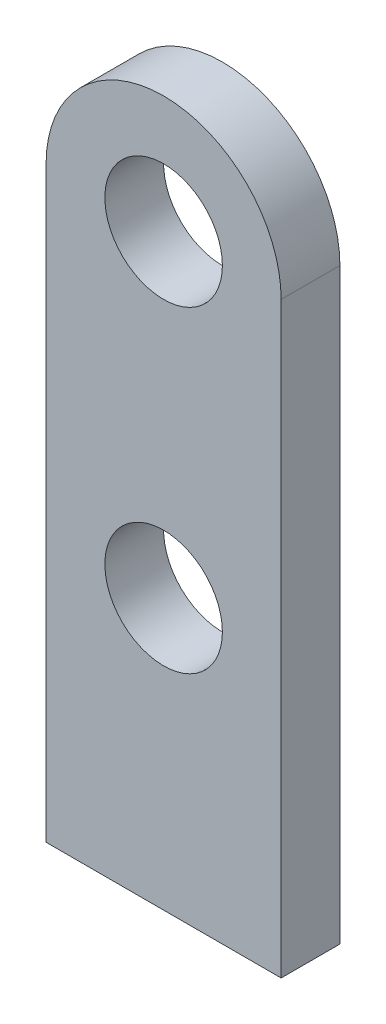
ISO-10303-21;
HEADER;
FILE_DESCRIPTION(('STEP AP214'),'2;1');
FILE_NAME('part.step','',(''),(''),'','','');
FILE_SCHEMA(('AUTOMOTIVE_DESIGN { 1 0 10303 214 1 1 1 1 }'));
ENDSEC;
DATA;
#1=APPLICATION_CONTEXT('core data for automotive mechanical design processes');
#2=APPLICATION_PROTOCOL_DEFINITION('international standard','automotive_design',2000,#1);
#3=PRODUCT_CONTEXT('',#1,'mechanical');
#4=PRODUCT('Part','Part','',(#3));
#5=PRODUCT_RELATED_PRODUCT_CATEGORY('part','',(#4));
#6=PRODUCT_DEFINITION_FORMATION('','',#4);
#7=PRODUCT_DEFINITION_CONTEXT('part definition',#1,'design');
#8=PRODUCT_DEFINITION('design','',#6,#7);
#9=PRODUCT_DEFINITION_SHAPE('','',#8);
#10=(LENGTH_UNIT() NAMED_UNIT(*) SI_UNIT(.MILLI.,.METRE.));
#11=(NAMED_UNIT(*) PLANE_ANGLE_UNIT() SI_UNIT($,.RADIAN.));
#12=(NAMED_UNIT(*) SI_UNIT($,.STERADIAN.) SOLID_ANGLE_UNIT());
#13=UNCERTAINTY_MEASURE_WITH_UNIT(LENGTH_MEASURE(1.E-05),#10,'distance_accuracy_value','');
#14=(GEOMETRIC_REPRESENTATION_CONTEXT(3) GLOBAL_UNCERTAINTY_ASSIGNED_CONTEXT((#13)) GLOBAL_UNIT_ASSIGNED_CONTEXT((#10,
#11,#12)) REPRESENTATION_CONTEXT('',''));
#15=CARTESIAN_POINT('',(0.,0.,0.));
#16=DIRECTION('',(0.,0.,1.));
#17=DIRECTION('',(1.,0.,0.));
#18=AXIS2_PLACEMENT_3D('',#15,#16,#17);
#19=CARTESIAN_POINT('',(0.,0.,10.));
#20=DIRECTION('',(0.,0.,-1.));
#21=DIRECTION('',(-1.,0.,0.));
#22=AXIS2_PLACEMENT_3D('',#19,#20,#21);
#23=CYLINDRICAL_SURFACE('',#22,20.);
#24=CARTESIAN_POINT('',(0.,0.,0.));
#25=DIRECTION('',(0.,0.,1.));
#26=DIRECTION('',(1.,0.,0.));
#27=AXIS2_PLACEMENT_3D('',#24,#25,#26);
#28=CIRCLE('',#27,20.);
#29=CARTESIAN_POINT('',(20.,0.,0.));
#30=VERTEX_POINT('',#29);
#31=CARTESIAN_POINT('',(-20.,0.,0.));
#32=VERTEX_POINT('',#31);
#33=EDGE_CURVE('E111',#30,#32,#28,.T.);
#34=ORIENTED_EDGE('',*,*,#33,.T.);
#35=DIRECTION('',(0.,0.,-1.));
#36=VECTOR('',#35,1.);
#37=CARTESIAN_POINT('',(-20.,0.,10.));
#38=LINE('',#37,#36);
#39=CARTESIAN_POINT('',(-20.,0.,10.));
#40=VERTEX_POINT('',#39);
#41=EDGE_CURVE('E11',#40,#32,#38,.T.);
#42=ORIENTED_EDGE('',*,*,#41,.F.);
#43=CARTESIAN_POINT('',(0.,0.,10.));
#44=DIRECTION('',(0.,0.,1.));
#45=DIRECTION('',(1.,0.,0.));
#46=AXIS2_PLACEMENT_3D('',#43,#44,#45);
#47=CIRCLE('',#46,20.);
#48=CARTESIAN_POINT('',(20.,0.,10.));
#49=VERTEX_POINT('',#48);
#50=EDGE_CURVE('E93',#49,#40,#47,.T.);
#51=ORIENTED_EDGE('',*,*,#50,.F.);
#52=DIRECTION('',(0.,0.,-1.));
#53=VECTOR('',#52,1.);
#54=CARTESIAN_POINT('',(20.,0.,10.));
#55=LINE('',#54,#53);
#56=EDGE_CURVE('E110',#49,#30,#55,.T.);
#57=ORIENTED_EDGE('',*,*,#56,.T.);
#58=EDGE_LOOP('',(#34,#42,#51,#57));
#59=FACE_BOUND('',#58,.T.);
#60=ADVANCED_FACE('F41',(#59),#23,.T.);
#61=CARTESIAN_POINT('',(-20.,0.,10.));
#62=DIRECTION('',(1.,0.,0.));
#63=DIRECTION('',(0.,1.,0.));
#64=AXIS2_PLACEMENT_3D('',#61,#62,#63);
#65=PLANE('',#64);
#66=DIRECTION('',(0.,-1.,0.));
#67=VECTOR('',#66,1.);
#68=CARTESIAN_POINT('',(-20.,0.,0.));
#69=LINE('',#68,#67);
#70=CARTESIAN_POINT('',(-20.,-100.,0.));
#71=VERTEX_POINT('',#70);
#72=EDGE_CURVE('E97',#32,#71,#69,.T.);
#73=ORIENTED_EDGE('',*,*,#72,.T.);
#74=DIRECTION('',(0.,0.,-1.));
#75=VECTOR('',#74,1.);
#76=CARTESIAN_POINT('',(-20.,-100.,10.));
#77=LINE('',#76,#75);
#78=CARTESIAN_POINT('',(-20.,-100.,10.));
#79=VERTEX_POINT('',#78);
#80=EDGE_CURVE('E49',#79,#71,#77,.T.);
#81=ORIENTED_EDGE('',*,*,#80,.F.);
#82=DIRECTION('',(0.,-1.,0.));
#83=VECTOR('',#82,1.);
#84=CARTESIAN_POINT('',(-20.,0.,10.));
#85=LINE('',#84,#83);
#86=EDGE_CURVE('E87',#40,#79,#85,.T.);
#87=ORIENTED_EDGE('',*,*,#86,.F.);
#88=ORIENTED_EDGE('',*,*,#41,.T.);
#89=EDGE_LOOP('',(#73,#81,#87,#88));
#90=FACE_BOUND('',#89,.T.);
#91=ADVANCED_FACE('F96',(#90),#65,.F.);
#92=CARTESIAN_POINT('',(0.,-100.,10.));
#93=DIRECTION('',(0.,1.,0.));
#94=DIRECTION('',(0.,0.,1.));
#95=AXIS2_PLACEMENT_3D('',#92,#93,#94);
#96=PLANE('',#95);
#97=DIRECTION('',(1.,0.,0.));
#98=VECTOR('',#97,1.);
#99=CARTESIAN_POINT('',(0.,-100.,0.));
#100=LINE('',#99,#98);
#101=CARTESIAN_POINT('',(20.,-100.,0.));
#102=VERTEX_POINT('',#101);
#103=EDGE_CURVE('E74',#71,#102,#100,.T.);
#104=ORIENTED_EDGE('',*,*,#103,.T.);
#105=DIRECTION('',(0.,0.,-1.));
#106=VECTOR('',#105,1.);
#107=CARTESIAN_POINT('',(20.,-100.,10.));
#108=LINE('',#107,#106);
#109=CARTESIAN_POINT('',(20.,-100.,10.));
#110=VERTEX_POINT('',#109);
#111=EDGE_CURVE('E98',#110,#102,#108,.T.);
#112=ORIENTED_EDGE('',*,*,#111,.F.);
#113=DIRECTION('',(1.,0.,0.));
#114=VECTOR('',#113,1.);
#115=CARTESIAN_POINT('',(0.,-100.,10.));
#116=LINE('',#115,#114);
#117=EDGE_CURVE('E91',#79,#110,#116,.T.);
#118=ORIENTED_EDGE('',*,*,#117,.F.);
#119=ORIENTED_EDGE('',*,*,#80,.T.);
#120=EDGE_LOOP('',(#104,#112,#118,#119));
#121=FACE_BOUND('',#120,.T.);
#122=ADVANCED_FACE('F99',(#121),#96,.F.);
#123=CARTESIAN_POINT('',(0.,-54.,10.));
#124=DIRECTION('',(0.,0.,-1.));
#125=DIRECTION('',(-1.,0.,0.));
#126=AXIS2_PLACEMENT_3D('',#123,#124,#125);
#127=CYLINDRICAL_SURFACE('',#126,10.);
#128=CARTESIAN_POINT('',(0.,-54.,10.));
#129=DIRECTION('',(0.,0.,1.));
#130=DIRECTION('',(1.,0.,0.));
#131=AXIS2_PLACEMENT_3D('',#128,#129,#130);
#132=CIRCLE('',#131,10.);
#133=CARTESIAN_POINT('',(10.,-54.,10.));
#134=VERTEX_POINT('',#133);
#135=EDGE_CURVE('E101',#134,#134,#132,.T.);
#136=ORIENTED_EDGE('',*,*,#135,.T.);
#137=EDGE_LOOP('',(#136));
#138=FACE_BOUND('',#137,.T.);
#139=CARTESIAN_POINT('',(0.,-54.,0.));
#140=DIRECTION('',(0.,0.,1.));
#141=DIRECTION('',(1.,0.,0.));
#142=AXIS2_PLACEMENT_3D('',#139,#140,#141);
#143=CIRCLE('',#142,10.);
#144=CARTESIAN_POINT('',(10.,-54.,0.));
#145=VERTEX_POINT('',#144);
#146=EDGE_CURVE('E117',#145,#145,#143,.T.);
#147=ORIENTED_EDGE('',*,*,#146,.F.);
#148=EDGE_LOOP('',(#147));
#149=FACE_BOUND('',#148,.T.);
#150=ADVANCED_FACE('F137',(#138,#149),#127,.F.);
#151=CARTESIAN_POINT('',(20.,0.,10.));
#152=DIRECTION('',(-1.,0.,0.));
#153=DIRECTION('',(0.,0.,1.));
#154=AXIS2_PLACEMENT_3D('',#151,#152,#153);
#155=PLANE('',#154);
#156=DIRECTION('',(0.,1.,0.));
#157=VECTOR('',#156,1.);
#158=CARTESIAN_POINT('',(20.,0.,0.));
#159=LINE('',#158,#157);
#160=EDGE_CURVE('E80',#102,#30,#159,.T.);
#161=ORIENTED_EDGE('',*,*,#160,.T.);
#162=ORIENTED_EDGE('',*,*,#56,.F.);
#163=DIRECTION('',(0.,1.,0.));
#164=VECTOR('',#163,1.);
#165=CARTESIAN_POINT('',(20.,0.,10.));
#166=LINE('',#165,#164);
#167=EDGE_CURVE('E57',#110,#49,#166,.T.);
#168=ORIENTED_EDGE('',*,*,#167,.F.);
#169=ORIENTED_EDGE('',*,*,#111,.T.);
#170=EDGE_LOOP('',(#161,#162,#168,#169));
#171=FACE_BOUND('',#170,.T.);
#172=ADVANCED_FACE('F124',(#171),#155,.F.);
#173=CARTESIAN_POINT('',(0.,0.,10.));
#174=DIRECTION('',(0.,0.,-1.));
#175=DIRECTION('',(-1.,0.,0.));
#176=AXIS2_PLACEMENT_3D('',#173,#174,#175);
#177=CYLINDRICAL_SURFACE('',#176,10.);
#178=CARTESIAN_POINT('',(0.,0.,10.));
#179=DIRECTION('',(0.,0.,1.));
#180=DIRECTION('',(1.,0.,0.));
#181=AXIS2_PLACEMENT_3D('',#178,#179,#180);
#182=CIRCLE('',#181,10.);
#183=CARTESIAN_POINT('',(10.,0.,10.));
#184=VERTEX_POINT('',#183);
#185=EDGE_CURVE('E107',#184,#184,#182,.T.);
#186=ORIENTED_EDGE('',*,*,#185,.T.);
#187=EDGE_LOOP('',(#186));
#188=FACE_BOUND('',#187,.T.);
#189=CARTESIAN_POINT('',(0.,0.,0.));
#190=DIRECTION('',(0.,0.,1.));
#191=DIRECTION('',(1.,0.,0.));
#192=AXIS2_PLACEMENT_3D('',#189,#190,#191);
#193=CIRCLE('',#192,10.);
#194=CARTESIAN_POINT('',(10.,0.,0.));
#195=VERTEX_POINT('',#194);
#196=EDGE_CURVE('E120',#195,#195,#193,.T.);
#197=ORIENTED_EDGE('',*,*,#196,.F.);
#198=EDGE_LOOP('',(#197));
#199=FACE_BOUND('',#198,.T.);
#200=ADVANCED_FACE('F142',(#188,#199),#177,.F.);
#201=CARTESIAN_POINT('',(0.,0.,10.));
#202=DIRECTION('',(0.,0.,1.));
#203=DIRECTION('',(1.,0.,0.));
#204=AXIS2_PLACEMENT_3D('',#201,#202,#203);
#205=PLANE('',#204);
#206=ORIENTED_EDGE('',*,*,#50,.T.);
#207=ORIENTED_EDGE('',*,*,#86,.T.);
#208=ORIENTED_EDGE('',*,*,#117,.T.);
#209=ORIENTED_EDGE('',*,*,#167,.T.);
#210=EDGE_LOOP('',(#206,#207,#208,#209));
#211=FACE_BOUND('',#210,.T.);
#212=ORIENTED_EDGE('',*,*,#135,.F.);
#213=EDGE_LOOP('',(#212));
#214=FACE_BOUND('',#213,.T.);
#215=ORIENTED_EDGE('',*,*,#185,.F.);
#216=EDGE_LOOP('',(#215));
#217=FACE_BOUND('',#216,.T.);
#218=ADVANCED_FACE('F88',(#211,#214,#217),#205,.T.);
#219=CARTESIAN_POINT('',(0.,0.,0.));
#220=DIRECTION('',(0.,0.,1.));
#221=DIRECTION('',(1.,0.,0.));
#222=AXIS2_PLACEMENT_3D('',#219,#220,#221);
#223=PLANE('',#222);
#224=ORIENTED_EDGE('',*,*,#33,.F.);
#225=ORIENTED_EDGE('',*,*,#160,.F.);
#226=ORIENTED_EDGE('',*,*,#103,.F.);
#227=ORIENTED_EDGE('',*,*,#72,.F.);
#228=EDGE_LOOP('',(#224,#225,#226,#227));
#229=FACE_BOUND('',#228,.T.);
#230=ORIENTED_EDGE('',*,*,#146,.T.);
#231=EDGE_LOOP('',(#230));
#232=FACE_BOUND('',#231,.T.);
#233=ORIENTED_EDGE('',*,*,#196,.T.);
#234=EDGE_LOOP('',(#233));
#235=FACE_BOUND('',#234,.T.);
#236=ADVANCED_FACE('F127',(#229,#232,#235),#223,.F.);
#237=CLOSED_SHELL('',(#60,#91,#122,#150,#172,#200,#218,#236));
#238=MANIFOLD_SOLID_BREP('B2',#237);
#239=ADVANCED_BREP_SHAPE_REPRESENTATION('',(#18,#238),#14);
#240=SHAPE_DEFINITION_REPRESENTATION(#9,#239);
ENDSEC;
END-ISO-10303-21;
